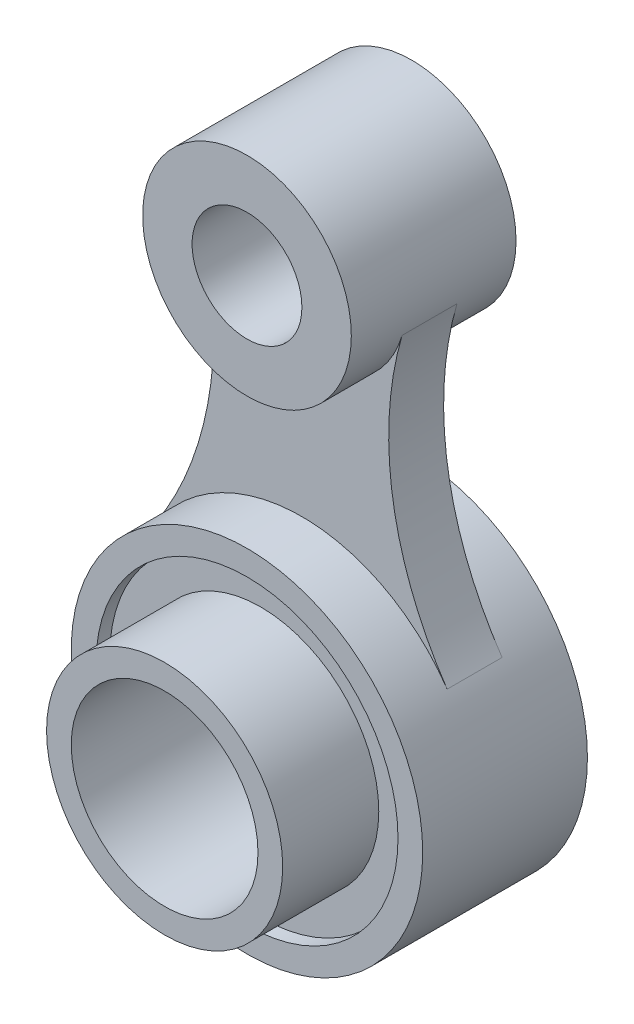
ISO-10303-21;
HEADER;
FILE_DESCRIPTION(('STEP AP214'),'2;1');
FILE_NAME('part.step','',(''),(''),'','','');
FILE_SCHEMA(('AUTOMOTIVE_DESIGN { 1 0 10303 214 1 1 1 1 }'));
ENDSEC;
DATA;
#1=APPLICATION_CONTEXT('core data for automotive mechanical design processes');
#2=APPLICATION_PROTOCOL_DEFINITION('international standard','automotive_design',2000,#1);
#3=PRODUCT_CONTEXT('',#1,'mechanical');
#4=PRODUCT('Part','Part','',(#3));
#5=PRODUCT_RELATED_PRODUCT_CATEGORY('part','',(#4));
#6=PRODUCT_DEFINITION_FORMATION('','',#4);
#7=PRODUCT_DEFINITION_CONTEXT('part definition',#1,'design');
#8=PRODUCT_DEFINITION('design','',#6,#7);
#9=PRODUCT_DEFINITION_SHAPE('','',#8);
#10=(LENGTH_UNIT() NAMED_UNIT(*) SI_UNIT(.MILLI.,.METRE.));
#11=(NAMED_UNIT(*) PLANE_ANGLE_UNIT() SI_UNIT($,.RADIAN.));
#12=(NAMED_UNIT(*) SI_UNIT($,.STERADIAN.) SOLID_ANGLE_UNIT());
#13=UNCERTAINTY_MEASURE_WITH_UNIT(LENGTH_MEASURE(1.E-05),#10,'distance_accuracy_value','');
#14=(GEOMETRIC_REPRESENTATION_CONTEXT(3) GLOBAL_UNCERTAINTY_ASSIGNED_CONTEXT((#13)) GLOBAL_UNIT_ASSIGNED_CONTEXT((#10,
#11,#12)) REPRESENTATION_CONTEXT('',''));
#15=CARTESIAN_POINT('',(0.,0.,0.));
#16=DIRECTION('',(0.,0.,1.));
#17=DIRECTION('',(1.,0.,0.));
#18=AXIS2_PLACEMENT_3D('',#15,#16,#17);
#19=CARTESIAN_POINT('',(7.95826379391457,0.,15.));
#20=DIRECTION('',(0.,0.,-1.));
#21=DIRECTION('',(-1.,0.,0.));
#22=AXIS2_PLACEMENT_3D('',#19,#20,#21);
#23=CYLINDRICAL_SURFACE('',#22,27.5);
#24=CARTESIAN_POINT('',(7.95826379391457,0.,-15.));
#25=DIRECTION('',(0.,0.,1.));
#26=DIRECTION('',(1.,0.,0.));
#27=AXIS2_PLACEMENT_3D('',#24,#25,#26);
#28=CIRCLE('',#27,27.5);
#29=CARTESIAN_POINT('',(35.4582637939146,0.,-15.));
#30=VERTEX_POINT('',#29);
#31=EDGE_CURVE('E150',#30,#30,#28,.T.);
#32=ORIENTED_EDGE('',*,*,#31,.F.);
#33=EDGE_LOOP('',(#32));
#34=FACE_BOUND('',#33,.T.);
#35=CARTESIAN_POINT('',(7.95826379391457,0.,-12.5));
#36=DIRECTION('',(0.,0.,1.));
#37=DIRECTION('',(1.,0.,0.));
#38=AXIS2_PLACEMENT_3D('',#35,#36,#37);
#39=CIRCLE('',#38,27.5);
#40=CARTESIAN_POINT('',(35.4582637939146,0.,-12.5));
#41=VERTEX_POINT('',#40);
#42=EDGE_CURVE('E161',#41,#41,#39,.T.);
#43=ORIENTED_EDGE('',*,*,#42,.T.);
#44=EDGE_LOOP('',(#43));
#45=FACE_BOUND('',#44,.T.);
#46=ADVANCED_FACE('F41',(#34,#45),#23,.F.);
#47=CARTESIAN_POINT('',(85.1928932174239,52.5672537338008,5.));
#48=DIRECTION('',(0.,0.,-1.));
#49=DIRECTION('',(-1.,0.,0.));
#50=AXIS2_PLACEMENT_3D('',#47,#48,#49);
#51=CYLINDRICAL_SURFACE('',#50,61.4264638488507);
#52=CARTESIAN_POINT('',(85.1928932174239,52.5672537338008,-5.));
#53=DIRECTION('',(0.,0.,1.));
#54=DIRECTION('',(1.,0.,0.));
#55=AXIS2_PLACEMENT_3D('',#52,#53,#54);
#56=CIRCLE('',#55,61.4264638488507);
#57=CARTESIAN_POINT('',(26.2042227584233,69.7004734678028,-5.));
#58=VERTEX_POINT('',#57);
#59=CARTESIAN_POINT('',(34.4123116057938,18.0050924564916,-5.));
#60=VERTEX_POINT('',#59);
#61=EDGE_CURVE('E94',#58,#60,#56,.T.);
#62=ORIENTED_EDGE('',*,*,#61,.F.);
#63=DIRECTION('',(0.,0.,-1.));
#64=VECTOR('',#63,1.);
#65=CARTESIAN_POINT('',(26.2042227584233,69.7004734678028,5.));
#66=LINE('',#65,#64);
#67=CARTESIAN_POINT('',(26.2042227584233,69.7004734678028,5.));
#68=VERTEX_POINT('',#67);
#69=EDGE_CURVE('E50',#68,#58,#66,.T.);
#70=ORIENTED_EDGE('',*,*,#69,.F.);
#71=CARTESIAN_POINT('',(85.1928932174239,52.5672537338008,5.));
#72=DIRECTION('',(0.,0.,1.));
#73=DIRECTION('',(1.,0.,0.));
#74=AXIS2_PLACEMENT_3D('',#71,#72,#73);
#75=CIRCLE('',#74,61.4264638488507);
#76=CARTESIAN_POINT('',(34.4123116057937,18.0050924564916,5.));
#77=VERTEX_POINT('',#76);
#78=EDGE_CURVE('E90',#68,#77,#75,.T.);
#79=ORIENTED_EDGE('',*,*,#78,.T.);
#80=DIRECTION('',(0.,0.,-1.));
#81=VECTOR('',#80,1.);
#82=CARTESIAN_POINT('',(34.4123116057938,18.0050924564916,5.));
#83=LINE('',#82,#81);
#84=EDGE_CURVE('E84',#77,#60,#83,.T.);
#85=ORIENTED_EDGE('',*,*,#84,.T.);
#86=EDGE_LOOP('',(#62,#70,#79,#85));
#87=FACE_BOUND('',#86,.T.);
#88=ADVANCED_FACE('F43',(#87),#51,.F.);
#89=CARTESIAN_POINT('',(-72.1322589324715,53.0222213205152,5.));
#90=DIRECTION('',(0.,0.,-1.));
#91=DIRECTION('',(-1.,0.,0.));
#92=AXIS2_PLACEMENT_3D('',#89,#90,#91);
#93=CYLINDRICAL_SURFACE('',#92,64.051276849126);
#94=CARTESIAN_POINT('',(-72.1322589324715,53.0222213205152,-5.));
#95=DIRECTION('',(0.,0.,1.));
#96=DIRECTION('',(1.,0.,0.));
#97=AXIS2_PLACEMENT_3D('',#94,#95,#96);
#98=CIRCLE('',#97,64.051276849126);
#99=CARTESIAN_POINT('',(-18.7243250411101,17.6646384922256,-5.));
#100=VERTEX_POINT('',#99);
#101=CARTESIAN_POINT('',(-10.3643916730898,69.972048465085,-5.));
#102=VERTEX_POINT('',#101);
#103=EDGE_CURVE('E91',#100,#102,#98,.T.);
#104=ORIENTED_EDGE('',*,*,#103,.F.);
#105=DIRECTION('',(0.,0.,-1.));
#106=VECTOR('',#105,1.);
#107=CARTESIAN_POINT('',(-18.7243250411101,17.6646384922256,5.));
#108=LINE('',#107,#106);
#109=CARTESIAN_POINT('',(-18.7243250411101,17.6646384922256,5.));
#110=VERTEX_POINT('',#109);
#111=EDGE_CURVE('E57',#110,#100,#108,.T.);
#112=ORIENTED_EDGE('',*,*,#111,.F.);
#113=CARTESIAN_POINT('',(-72.1322589324715,53.0222213205152,5.));
#114=DIRECTION('',(0.,0.,1.));
#115=DIRECTION('',(1.,0.,0.));
#116=AXIS2_PLACEMENT_3D('',#113,#114,#115);
#117=CIRCLE('',#116,64.051276849126);
#118=CARTESIAN_POINT('',(-10.3643916730898,69.972048465085,5.));
#119=VERTEX_POINT('',#118);
#120=EDGE_CURVE('E125',#110,#119,#117,.T.);
#121=ORIENTED_EDGE('',*,*,#120,.T.);
#122=DIRECTION('',(0.,0.,-1.));
#123=VECTOR('',#122,1.);
#124=CARTESIAN_POINT('',(-10.3643916730898,69.972048465085,5.));
#125=LINE('',#124,#123);
#126=EDGE_CURVE('E119',#119,#102,#125,.T.);
#127=ORIENTED_EDGE('',*,*,#126,.T.);
#128=EDGE_LOOP('',(#104,#112,#121,#127));
#129=FACE_BOUND('',#128,.T.);
#130=ADVANCED_FACE('F221',(#129),#93,.F.);
#131=CARTESIAN_POINT('',(0.,0.,5.));
#132=DIRECTION('',(0.,0.,1.));
#133=DIRECTION('',(1.,0.,0.));
#134=AXIS2_PLACEMENT_3D('',#131,#132,#133);
#135=PLANE('',#134);
#136=ORIENTED_EDGE('',*,*,#78,.F.);
#137=CARTESIAN_POINT('',(7.95826379391456,75.,5.));
#138=DIRECTION('',(0.,0.,1.));
#139=DIRECTION('',(1.,0.,0.));
#140=AXIS2_PLACEMENT_3D('',#137,#138,#139);
#141=CIRCLE('',#140,19.);
#142=EDGE_CURVE('E128',#119,#68,#141,.T.);
#143=ORIENTED_EDGE('',*,*,#142,.F.);
#144=ORIENTED_EDGE('',*,*,#120,.F.);
#145=CARTESIAN_POINT('',(7.95826379391457,0.,5.));
#146=DIRECTION('',(0.,0.,1.));
#147=DIRECTION('',(1.,0.,0.));
#148=AXIS2_PLACEMENT_3D('',#145,#146,#147);
#149=CIRCLE('',#148,32.);
#150=EDGE_CURVE('E99',#77,#110,#149,.T.);
#151=ORIENTED_EDGE('',*,*,#150,.F.);
#152=EDGE_LOOP('',(#136,#143,#144,#151));
#153=FACE_BOUND('',#152,.T.);
#154=ADVANCED_FACE('F334',(#153),#135,.T.);
#155=CARTESIAN_POINT('',(0.,0.,-5.));
#156=DIRECTION('',(0.,0.,1.));
#157=DIRECTION('',(1.,0.,0.));
#158=AXIS2_PLACEMENT_3D('',#155,#156,#157);
#159=PLANE('',#158);
#160=ORIENTED_EDGE('',*,*,#61,.T.);
#161=CARTESIAN_POINT('',(7.95826379391457,0.,-5.));
#162=DIRECTION('',(0.,0.,1.));
#163=DIRECTION('',(1.,0.,0.));
#164=AXIS2_PLACEMENT_3D('',#161,#162,#163);
#165=CIRCLE('',#164,32.);
#166=EDGE_CURVE('E80',#60,#100,#165,.T.);
#167=ORIENTED_EDGE('',*,*,#166,.T.);
#168=ORIENTED_EDGE('',*,*,#103,.T.);
#169=CARTESIAN_POINT('',(7.95826379391456,75.,-5.));
#170=DIRECTION('',(0.,0.,1.));
#171=DIRECTION('',(1.,0.,0.));
#172=AXIS2_PLACEMENT_3D('',#169,#170,#171);
#173=CIRCLE('',#172,19.);
#174=EDGE_CURVE('E102',#102,#58,#173,.T.);
#175=ORIENTED_EDGE('',*,*,#174,.T.);
#176=EDGE_LOOP('',(#160,#167,#168,#175));
#177=FACE_BOUND('',#176,.T.);
#178=ADVANCED_FACE('F101',(#177),#159,.F.);
#179=CARTESIAN_POINT('',(7.95826379391456,75.,15.));
#180=DIRECTION('',(0.,0.,-1.));
#181=DIRECTION('',(-1.,0.,0.));
#182=AXIS2_PLACEMENT_3D('',#179,#180,#181);
#183=CYLINDRICAL_SURFACE('',#182,10.);
#184=CARTESIAN_POINT('',(7.95826379391456,75.,15.));
#185=DIRECTION('',(0.,0.,1.));
#186=DIRECTION('',(1.,0.,0.));
#187=AXIS2_PLACEMENT_3D('',#184,#185,#186);
#188=CIRCLE('',#187,10.);
#189=CARTESIAN_POINT('',(17.9582637939146,75.,15.));
#190=VERTEX_POINT('',#189);
#191=EDGE_CURVE('E110',#190,#190,#188,.T.);
#192=ORIENTED_EDGE('',*,*,#191,.T.);
#193=EDGE_LOOP('',(#192));
#194=FACE_BOUND('',#193,.T.);
#195=CARTESIAN_POINT('',(7.95826379391456,75.,-15.));
#196=DIRECTION('',(0.,0.,1.));
#197=DIRECTION('',(1.,0.,0.));
#198=AXIS2_PLACEMENT_3D('',#195,#196,#197);
#199=CIRCLE('',#198,10.);
#200=CARTESIAN_POINT('',(17.9582637939146,75.,-15.));
#201=VERTEX_POINT('',#200);
#202=EDGE_CURVE('E137',#201,#201,#199,.T.);
#203=ORIENTED_EDGE('',*,*,#202,.F.);
#204=EDGE_LOOP('',(#203));
#205=FACE_BOUND('',#204,.T.);
#206=ADVANCED_FACE('F333',(#194,#205),#183,.F.);
#207=CARTESIAN_POINT('',(7.95826379391456,75.,15.));
#208=DIRECTION('',(0.,0.,-1.));
#209=DIRECTION('',(-1.,0.,0.));
#210=AXIS2_PLACEMENT_3D('',#207,#208,#209);
#211=CYLINDRICAL_SURFACE('',#210,19.);
#212=ORIENTED_EDGE('',*,*,#142,.T.);
#213=ORIENTED_EDGE('',*,*,#69,.T.);
#214=ORIENTED_EDGE('',*,*,#174,.F.);
#215=ORIENTED_EDGE('',*,*,#126,.F.);
#216=EDGE_LOOP('',(#212,#213,#214,#215));
#217=FACE_BOUND('',#216,.T.);
#218=CARTESIAN_POINT('',(7.95826379391456,75.,15.));
#219=DIRECTION('',(0.,0.,1.));
#220=DIRECTION('',(1.,0.,0.));
#221=AXIS2_PLACEMENT_3D('',#218,#219,#220);
#222=CIRCLE('',#221,19.);
#223=CARTESIAN_POINT('',(26.9582637939146,75.,15.));
#224=VERTEX_POINT('',#223);
#225=EDGE_CURVE('E104',#224,#224,#222,.T.);
#226=ORIENTED_EDGE('',*,*,#225,.F.);
#227=EDGE_LOOP('',(#226));
#228=FACE_BOUND('',#227,.T.);
#229=CARTESIAN_POINT('',(7.95826379391456,75.,-15.));
#230=DIRECTION('',(0.,0.,1.));
#231=DIRECTION('',(1.,0.,0.));
#232=AXIS2_PLACEMENT_3D('',#229,#230,#231);
#233=CIRCLE('',#232,19.);
#234=CARTESIAN_POINT('',(26.9582637939146,75.,-15.));
#235=VERTEX_POINT('',#234);
#236=EDGE_CURVE('E133',#235,#235,#233,.T.);
#237=ORIENTED_EDGE('',*,*,#236,.T.);
#238=EDGE_LOOP('',(#237));
#239=FACE_BOUND('',#238,.T.);
#240=ADVANCED_FACE('F373',(#217,#228,#239),#211,.T.);
#241=CARTESIAN_POINT('',(0.,0.,15.));
#242=DIRECTION('',(0.,0.,1.));
#243=DIRECTION('',(1.,0.,0.));
#244=AXIS2_PLACEMENT_3D('',#241,#242,#243);
#245=PLANE('',#244);
#246=ORIENTED_EDGE('',*,*,#191,.F.);
#247=EDGE_LOOP('',(#246));
#248=FACE_BOUND('',#247,.T.);
#249=ORIENTED_EDGE('',*,*,#225,.T.);
#250=EDGE_LOOP('',(#249));
#251=FACE_BOUND('',#250,.T.);
#252=ADVANCED_FACE('F234',(#248,#251),#245,.T.);
#253=CARTESIAN_POINT('',(0.,0.,-15.));
#254=DIRECTION('',(0.,0.,1.));
#255=DIRECTION('',(1.,0.,0.));
#256=AXIS2_PLACEMENT_3D('',#253,#254,#255);
#257=PLANE('',#256);
#258=ORIENTED_EDGE('',*,*,#202,.T.);
#259=EDGE_LOOP('',(#258));
#260=FACE_BOUND('',#259,.T.);
#261=ORIENTED_EDGE('',*,*,#236,.F.);
#262=EDGE_LOOP('',(#261));
#263=FACE_BOUND('',#262,.T.);
#264=ADVANCED_FACE('F227',(#260,#263),#257,.F.);
#265=CARTESIAN_POINT('',(7.95826379391457,0.,12.5));
#266=DIRECTION('',(0.,0.,1.));
#267=DIRECTION('',(1.,0.,0.));
#268=AXIS2_PLACEMENT_3D('',#265,#266,#267);
#269=CIRCLE('',#268,27.5);
#270=CARTESIAN_POINT('',(35.4582637939146,0.,12.5));
#271=VERTEX_POINT('',#270);
#272=EDGE_CURVE('E11',#271,#271,#269,.T.);
#273=ORIENTED_EDGE('',*,*,#272,.F.);
#274=EDGE_LOOP('',(#273));
#275=FACE_BOUND('',#274,.T.);
#276=CARTESIAN_POINT('',(7.95826379391457,0.,15.));
#277=DIRECTION('',(0.,0.,1.));
#278=DIRECTION('',(1.,0.,0.));
#279=AXIS2_PLACEMENT_3D('',#276,#277,#278);
#280=CIRCLE('',#279,27.5);
#281=CARTESIAN_POINT('',(35.4582637939146,0.,15.));
#282=VERTEX_POINT('',#281);
#283=EDGE_CURVE('E149',#282,#282,#280,.T.);
#284=ORIENTED_EDGE('',*,*,#283,.T.);
#285=EDGE_LOOP('',(#284));
#286=FACE_BOUND('',#285,.T.);
#287=ADVANCED_FACE('F217',(#275,#286),#23,.F.);
#288=CARTESIAN_POINT('',(7.95826379391457,0.,15.));
#289=DIRECTION('',(0.,0.,-1.));
#290=DIRECTION('',(-1.,0.,0.));
#291=AXIS2_PLACEMENT_3D('',#288,#289,#290);
#292=CYLINDRICAL_SURFACE('',#291,32.);
#293=ORIENTED_EDGE('',*,*,#150,.T.);
#294=ORIENTED_EDGE('',*,*,#111,.T.);
#295=ORIENTED_EDGE('',*,*,#166,.F.);
#296=ORIENTED_EDGE('',*,*,#84,.F.);
#297=EDGE_LOOP('',(#293,#294,#295,#296));
#298=FACE_BOUND('',#297,.T.);
#299=CARTESIAN_POINT('',(7.95826379391457,0.,15.));
#300=DIRECTION('',(0.,0.,1.));
#301=DIRECTION('',(1.,0.,0.));
#302=AXIS2_PLACEMENT_3D('',#299,#300,#301);
#303=CIRCLE('',#302,32.);
#304=CARTESIAN_POINT('',(39.9582637939146,0.,15.));
#305=VERTEX_POINT('',#304);
#306=EDGE_CURVE('E140',#305,#305,#303,.T.);
#307=ORIENTED_EDGE('',*,*,#306,.F.);
#308=EDGE_LOOP('',(#307));
#309=FACE_BOUND('',#308,.T.);
#310=CARTESIAN_POINT('',(7.95826379391457,0.,-15.));
#311=DIRECTION('',(0.,0.,1.));
#312=DIRECTION('',(1.,0.,0.));
#313=AXIS2_PLACEMENT_3D('',#310,#311,#312);
#314=CIRCLE('',#313,32.);
#315=CARTESIAN_POINT('',(39.9582637939146,0.,-15.));
#316=VERTEX_POINT('',#315);
#317=EDGE_CURVE('E145',#316,#316,#314,.T.);
#318=ORIENTED_EDGE('',*,*,#317,.T.);
#319=EDGE_LOOP('',(#318));
#320=FACE_BOUND('',#319,.T.);
#321=ADVANCED_FACE('F82',(#298,#309,#320),#292,.T.);
#322=CARTESIAN_POINT('',(0.,0.,15.));
#323=DIRECTION('',(0.,0.,1.));
#324=DIRECTION('',(1.,0.,0.));
#325=AXIS2_PLACEMENT_3D('',#322,#323,#324);
#326=PLANE('',#325);
#327=ORIENTED_EDGE('',*,*,#283,.F.);
#328=EDGE_LOOP('',(#327));
#329=FACE_BOUND('',#328,.T.);
#330=ORIENTED_EDGE('',*,*,#306,.T.);
#331=EDGE_LOOP('',(#330));
#332=FACE_BOUND('',#331,.T.);
#333=ADVANCED_FACE('F233',(#329,#332),#326,.T.);
#334=CARTESIAN_POINT('',(0.,0.,-15.));
#335=DIRECTION('',(0.,0.,1.));
#336=DIRECTION('',(1.,0.,0.));
#337=AXIS2_PLACEMENT_3D('',#334,#335,#336);
#338=PLANE('',#337);
#339=ORIENTED_EDGE('',*,*,#31,.T.);
#340=EDGE_LOOP('',(#339));
#341=FACE_BOUND('',#340,.T.);
#342=ORIENTED_EDGE('',*,*,#317,.F.);
#343=EDGE_LOOP('',(#342));
#344=FACE_BOUND('',#343,.T.);
#345=ADVANCED_FACE('F243',(#341,#344),#338,.F.);
#346=CARTESIAN_POINT('',(0.,0.,12.5));
#347=DIRECTION('',(0.,0.,1.));
#348=DIRECTION('',(1.,0.,0.));
#349=AXIS2_PLACEMENT_3D('',#346,#347,#348);
#350=PLANE('',#349);
#351=CARTESIAN_POINT('',(7.95826379391457,0.,12.5));
#352=DIRECTION('',(0.,0.,1.));
#353=DIRECTION('',(1.,0.,0.));
#354=AXIS2_PLACEMENT_3D('',#351,#352,#353);
#355=CIRCLE('',#354,21.5);
#356=CARTESIAN_POINT('',(29.4582637939146,0.,12.5));
#357=VERTEX_POINT('',#356);
#358=EDGE_CURVE('E154',#357,#357,#355,.T.);
#359=ORIENTED_EDGE('',*,*,#358,.F.);
#360=EDGE_LOOP('',(#359));
#361=FACE_BOUND('',#360,.T.);
#362=ORIENTED_EDGE('',*,*,#272,.T.);
#363=EDGE_LOOP('',(#362));
#364=FACE_BOUND('',#363,.T.);
#365=ADVANCED_FACE('F250',(#361,#364),#350,.T.);
#366=CARTESIAN_POINT('',(0.,0.,-12.5));
#367=DIRECTION('',(0.,0.,1.));
#368=DIRECTION('',(1.,0.,0.));
#369=AXIS2_PLACEMENT_3D('',#366,#367,#368);
#370=PLANE('',#369);
#371=CARTESIAN_POINT('',(7.95826379391457,0.,-12.5));
#372=DIRECTION('',(0.,0.,1.));
#373=DIRECTION('',(1.,0.,0.));
#374=AXIS2_PLACEMENT_3D('',#371,#372,#373);
#375=CIRCLE('',#374,21.5);
#376=CARTESIAN_POINT('',(29.4582637939146,0.,-12.5));
#377=VERTEX_POINT('',#376);
#378=EDGE_CURVE('E165',#377,#377,#375,.T.);
#379=ORIENTED_EDGE('',*,*,#378,.T.);
#380=EDGE_LOOP('',(#379));
#381=FACE_BOUND('',#380,.T.);
#382=ORIENTED_EDGE('',*,*,#42,.F.);
#383=EDGE_LOOP('',(#382));
#384=FACE_BOUND('',#383,.T.);
#385=ADVANCED_FACE('F212',(#381,#384),#370,.F.);
#386=CARTESIAN_POINT('',(7.95826379391457,0.,-15.));
#387=DIRECTION('',(0.,0.,1.));
#388=DIRECTION('',(1.,0.,0.));
#389=AXIS2_PLACEMENT_3D('',#386,#387,#388);
#390=CYLINDRICAL_SURFACE('',#389,21.5);
#391=CARTESIAN_POINT('',(7.95826379391457,0.,-15.));
#392=DIRECTION('',(0.,0.,1.));
#393=DIRECTION('',(1.,0.,0.));
#394=AXIS2_PLACEMENT_3D('',#391,#392,#393);
#395=CIRCLE('',#394,21.5);
#396=CARTESIAN_POINT('',(29.4582637939146,0.,-15.));
#397=VERTEX_POINT('',#396);
#398=EDGE_CURVE('E172',#397,#397,#395,.T.);
#399=ORIENTED_EDGE('',*,*,#398,.T.);
#400=EDGE_LOOP('',(#399));
#401=FACE_BOUND('',#400,.T.);
#402=ORIENTED_EDGE('',*,*,#378,.F.);
#403=EDGE_LOOP('',(#402));
#404=FACE_BOUND('',#403,.T.);
#405=ADVANCED_FACE('F202',(#401,#404),#390,.T.);
#406=CARTESIAN_POINT('',(7.95826379391457,0.,-15.));
#407=DIRECTION('',(0.,0.,1.));
#408=DIRECTION('',(1.,0.,0.));
#409=AXIS2_PLACEMENT_3D('',#406,#407,#408);
#410=CYLINDRICAL_SURFACE('',#409,17.);
#411=CARTESIAN_POINT('',(7.95826379391457,0.,-15.));
#412=DIRECTION('',(0.,0.,1.));
#413=DIRECTION('',(1.,0.,0.));
#414=AXIS2_PLACEMENT_3D('',#411,#412,#413);
#415=CIRCLE('',#414,17.);
#416=CARTESIAN_POINT('',(24.9582637939146,0.,-15.));
#417=VERTEX_POINT('',#416);
#418=EDGE_CURVE('E176',#417,#417,#415,.T.);
#419=ORIENTED_EDGE('',*,*,#418,.F.);
#420=EDGE_LOOP('',(#419));
#421=FACE_BOUND('',#420,.T.);
#422=CARTESIAN_POINT('',(7.95826379391457,0.,30.));
#423=DIRECTION('',(0.,0.,1.));
#424=DIRECTION('',(1.,0.,0.));
#425=AXIS2_PLACEMENT_3D('',#422,#423,#424);
#426=CIRCLE('',#425,17.);
#427=CARTESIAN_POINT('',(24.9582637939146,0.,30.));
#428=VERTEX_POINT('',#427);
#429=EDGE_CURVE('E184',#428,#428,#426,.T.);
#430=ORIENTED_EDGE('',*,*,#429,.T.);
#431=EDGE_LOOP('',(#430));
#432=FACE_BOUND('',#431,.T.);
#433=ADVANCED_FACE('F189',(#421,#432),#410,.F.);
#434=ORIENTED_EDGE('',*,*,#358,.T.);
#435=EDGE_LOOP('',(#434));
#436=FACE_BOUND('',#435,.T.);
#437=CARTESIAN_POINT('',(7.95826379391457,0.,30.));
#438=DIRECTION('',(0.,0.,1.));
#439=DIRECTION('',(1.,0.,0.));
#440=AXIS2_PLACEMENT_3D('',#437,#438,#439);
#441=CIRCLE('',#440,21.5);
#442=CARTESIAN_POINT('',(29.4582637939146,0.,30.));
#443=VERTEX_POINT('',#442);
#444=EDGE_CURVE('E180',#443,#443,#441,.T.);
#445=ORIENTED_EDGE('',*,*,#444,.F.);
#446=EDGE_LOOP('',(#445));
#447=FACE_BOUND('',#446,.T.);
#448=ADVANCED_FACE('F198',(#436,#447),#390,.T.);
#449=CARTESIAN_POINT('',(0.,0.,-15.));
#450=DIRECTION('',(0.,0.,1.));
#451=DIRECTION('',(1.,0.,0.));
#452=AXIS2_PLACEMENT_3D('',#449,#450,#451);
#453=PLANE('',#452);
#454=ORIENTED_EDGE('',*,*,#418,.T.);
#455=EDGE_LOOP('',(#454));
#456=FACE_BOUND('',#455,.T.);
#457=ORIENTED_EDGE('',*,*,#398,.F.);
#458=EDGE_LOOP('',(#457));
#459=FACE_BOUND('',#458,.T.);
#460=ADVANCED_FACE('F194',(#456,#459),#453,.F.);
#461=CARTESIAN_POINT('',(0.,0.,30.));
#462=DIRECTION('',(0.,0.,1.));
#463=DIRECTION('',(1.,0.,0.));
#464=AXIS2_PLACEMENT_3D('',#461,#462,#463);
#465=PLANE('',#464);
#466=ORIENTED_EDGE('',*,*,#429,.F.);
#467=EDGE_LOOP('',(#466));
#468=FACE_BOUND('',#467,.T.);
#469=ORIENTED_EDGE('',*,*,#444,.T.);
#470=EDGE_LOOP('',(#469));
#471=FACE_BOUND('',#470,.T.);
#472=ADVANCED_FACE('F191',(#468,#471),#465,.T.);
#473=CLOSED_SHELL('',(#46,#88,#130,#154,#178,#206,#240,#252,#264,#287,#321,#333,#345,#365,#385,
#405,#433,#448,#460,#472));
#474=MANIFOLD_SOLID_BREP('B2',#473);
#475=ADVANCED_BREP_SHAPE_REPRESENTATION('',(#18,#474),#14);
#476=SHAPE_DEFINITION_REPRESENTATION(#9,#475);
ENDSEC;
END-ISO-10303-21;
